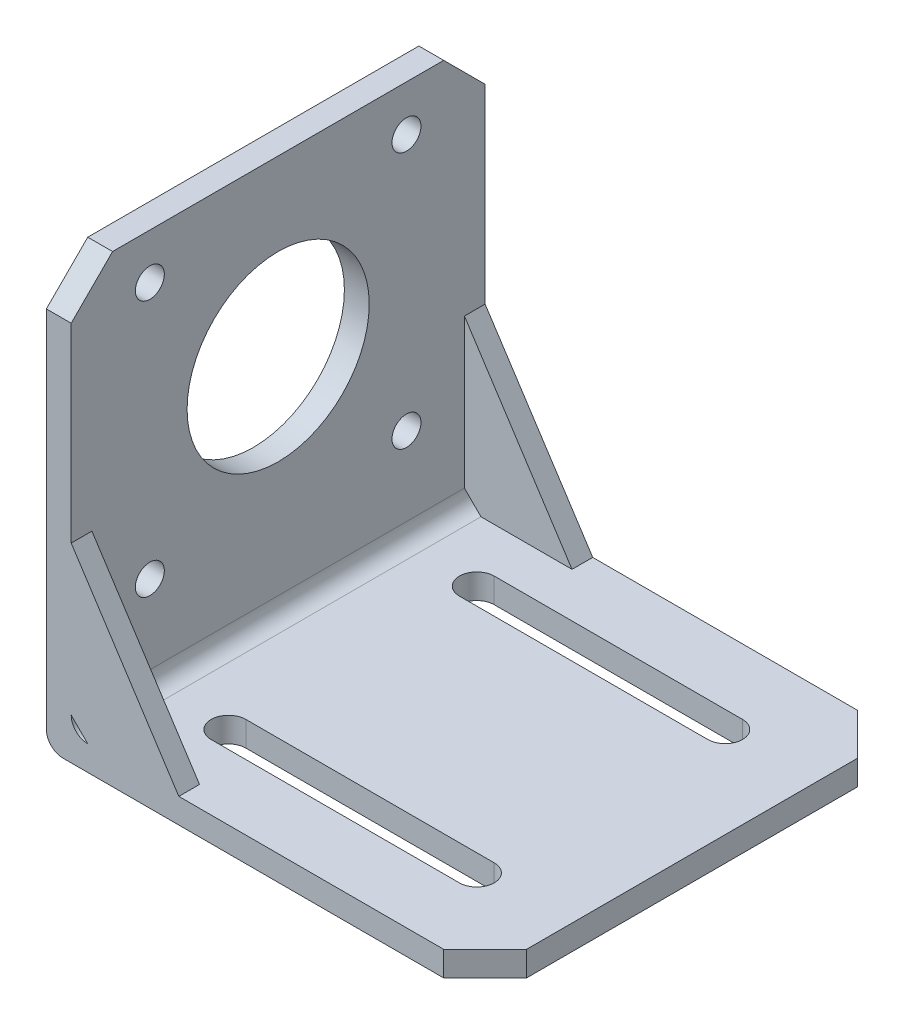
ISO-10303-21;
HEADER;
FILE_DESCRIPTION(('STEP AP214'),'2;1');
FILE_NAME('part.step','',(''),(''),'','','');
FILE_SCHEMA(('AUTOMOTIVE_DESIGN { 1 0 10303 214 1 1 1 1 }'));
ENDSEC;
DATA;
#1=APPLICATION_CONTEXT('core data for automotive mechanical design processes');
#2=APPLICATION_PROTOCOL_DEFINITION('international standard','automotive_design',2000,#1);
#3=PRODUCT_CONTEXT('',#1,'mechanical');
#4=PRODUCT('Part','Part','',(#3));
#5=PRODUCT_RELATED_PRODUCT_CATEGORY('part','',(#4));
#6=PRODUCT_DEFINITION_FORMATION('','',#4);
#7=PRODUCT_DEFINITION_CONTEXT('part definition',#1,'design');
#8=PRODUCT_DEFINITION('design','',#6,#7);
#9=PRODUCT_DEFINITION_SHAPE('','',#8);
#10=(LENGTH_UNIT() NAMED_UNIT(*) SI_UNIT(.MILLI.,.METRE.));
#11=(NAMED_UNIT(*) PLANE_ANGLE_UNIT() SI_UNIT($,.RADIAN.));
#12=(NAMED_UNIT(*) SI_UNIT($,.STERADIAN.) SOLID_ANGLE_UNIT());
#13=UNCERTAINTY_MEASURE_WITH_UNIT(LENGTH_MEASURE(1.E-05),#10,'distance_accuracy_value','');
#14=(GEOMETRIC_REPRESENTATION_CONTEXT(3) GLOBAL_UNCERTAINTY_ASSIGNED_CONTEXT((#13)) GLOBAL_UNIT_ASSIGNED_CONTEXT((#10,
#11,#12)) REPRESENTATION_CONTEXT('',''));
#15=CARTESIAN_POINT('',(0.,0.,0.));
#16=DIRECTION('',(0.,0.,1.));
#17=DIRECTION('',(1.,0.,0.));
#18=AXIS2_PLACEMENT_3D('',#15,#16,#17);
#19=CARTESIAN_POINT('',(-50.,3.,25.));
#20=DIRECTION('',(0.,-1.,0.));
#21=DIRECTION('',(0.,0.,-1.));
#22=AXIS2_PLACEMENT_3D('',#19,#20,#21);
#23=PLANE('',#22);
#24=DIRECTION('',(1.,0.,0.));
#25=VECTOR('',#24,1.);
#26=CARTESIAN_POINT('',(-41.,3.,17.1));
#27=LINE('',#26,#25);
#28=CARTESIAN_POINT('',(-41.,3.,17.1));
#29=VERTEX_POINT('',#28);
#30=CARTESIAN_POINT('',(-11.,3.,17.1));
#31=VERTEX_POINT('',#30);
#32=EDGE_CURVE('E368',#29,#31,#27,.T.);
#33=ORIENTED_EDGE('',*,*,#32,.F.);
#34=CARTESIAN_POINT('',(-41.,3.,15.));
#35=DIRECTION('',(0.,1.,0.));
#36=DIRECTION('',(0.,0.,1.));
#37=AXIS2_PLACEMENT_3D('',#34,#35,#36);
#38=CIRCLE('',#37,2.1);
#39=CARTESIAN_POINT('',(-41.,3.,12.9));
#40=VERTEX_POINT('',#39);
#41=EDGE_CURVE('E371',#40,#29,#38,.T.);
#42=ORIENTED_EDGE('',*,*,#41,.F.);
#43=DIRECTION('',(-1.,0.,0.));
#44=VECTOR('',#43,1.);
#45=CARTESIAN_POINT('',(-41.,3.,12.9));
#46=LINE('',#45,#44);
#47=CARTESIAN_POINT('',(-11.,3.,12.9));
#48=VERTEX_POINT('',#47);
#49=EDGE_CURVE('E358',#48,#40,#46,.T.);
#50=ORIENTED_EDGE('',*,*,#49,.F.);
#51=CARTESIAN_POINT('',(-11.,3.,15.));
#52=DIRECTION('',(0.,1.,0.));
#53=DIRECTION('',(0.,0.,1.));
#54=AXIS2_PLACEMENT_3D('',#51,#52,#53);
#55=CIRCLE('',#54,2.1);
#56=EDGE_CURVE('E365',#31,#48,#55,.T.);
#57=ORIENTED_EDGE('',*,*,#56,.F.);
#58=EDGE_LOOP('',(#33,#42,#50,#57));
#59=FACE_BOUND('',#58,.T.);
#60=DIRECTION('',(1.,0.,0.));
#61=VECTOR('',#60,1.);
#62=CARTESIAN_POINT('',(-41.,3.,-12.9));
#63=LINE('',#62,#61);
#64=CARTESIAN_POINT('',(-41.,3.,-12.9));
#65=VERTEX_POINT('',#64);
#66=CARTESIAN_POINT('',(-11.,3.,-12.9));
#67=VERTEX_POINT('',#66);
#68=EDGE_CURVE('E399',#65,#67,#63,.T.);
#69=ORIENTED_EDGE('',*,*,#68,.F.);
#70=CARTESIAN_POINT('',(-41.,3.,-15.));
#71=DIRECTION('',(0.,1.,0.));
#72=DIRECTION('',(0.,0.,1.));
#73=AXIS2_PLACEMENT_3D('',#70,#71,#72);
#74=CIRCLE('',#73,2.1);
#75=CARTESIAN_POINT('',(-41.,3.,-17.1));
#76=VERTEX_POINT('',#75);
#77=EDGE_CURVE('E402',#76,#65,#74,.T.);
#78=ORIENTED_EDGE('',*,*,#77,.F.);
#79=DIRECTION('',(-1.,0.,0.));
#80=VECTOR('',#79,1.);
#81=CARTESIAN_POINT('',(-41.,3.,-17.1));
#82=LINE('',#81,#80);
#83=CARTESIAN_POINT('',(-11.,3.,-17.1));
#84=VERTEX_POINT('',#83);
#85=EDGE_CURVE('E389',#84,#76,#82,.T.);
#86=ORIENTED_EDGE('',*,*,#85,.F.);
#87=CARTESIAN_POINT('',(-11.,3.,-15.));
#88=DIRECTION('',(0.,1.,0.));
#89=DIRECTION('',(0.,0.,1.));
#90=AXIS2_PLACEMENT_3D('',#87,#88,#89);
#91=CIRCLE('',#90,2.1);
#92=EDGE_CURVE('E396',#67,#84,#91,.T.);
#93=ORIENTED_EDGE('',*,*,#92,.F.);
#94=EDGE_LOOP('',(#69,#78,#86,#93));
#95=FACE_BOUND('',#94,.T.);
#96=DIRECTION('',(0.,0.,-1.));
#97=VECTOR('',#96,1.);
#98=CARTESIAN_POINT('',(-37.,3.,-22.5));
#99=LINE('',#98,#97);
#100=CARTESIAN_POINT('',(-37.,3.,-22.5));
#101=VERTEX_POINT('',#100);
#102=CARTESIAN_POINT('',(-37.,3.,-25.));
#103=VERTEX_POINT('',#102);
#104=EDGE_CURVE('E51',#101,#103,#99,.T.);
#105=ORIENTED_EDGE('',*,*,#104,.F.);
#106=DIRECTION('',(1.,0.,0.));
#107=VECTOR('',#106,1.);
#108=CARTESIAN_POINT('',(-48.,3.,-22.5));
#109=LINE('',#108,#107);
#110=CARTESIAN_POINT('',(-48.,3.,-22.5));
#111=VERTEX_POINT('',#110);
#112=EDGE_CURVE('E219',#111,#101,#109,.T.);
#113=ORIENTED_EDGE('',*,*,#112,.F.);
#114=DIRECTION('',(0.,0.,-1.));
#115=VECTOR('',#114,1.);
#116=CARTESIAN_POINT('',(-48.,3.,25.));
#117=LINE('',#116,#115);
#118=CARTESIAN_POINT('',(-48.,3.,22.5));
#119=VERTEX_POINT('',#118);
#120=EDGE_CURVE('E210',#111,#119,#117,.F.);
#121=ORIENTED_EDGE('',*,*,#120,.T.);
#122=DIRECTION('',(1.,0.,0.));
#123=VECTOR('',#122,1.);
#124=CARTESIAN_POINT('',(-48.,3.,22.5));
#125=LINE('',#124,#123);
#126=CARTESIAN_POINT('',(-37.,3.,22.5));
#127=VERTEX_POINT('',#126);
#128=EDGE_CURVE('E414',#119,#127,#125,.T.);
#129=ORIENTED_EDGE('',*,*,#128,.T.);
#130=DIRECTION('',(0.,0.,1.));
#131=VECTOR('',#130,1.);
#132=CARTESIAN_POINT('',(-37.,3.,22.5));
#133=LINE('',#132,#131);
#134=CARTESIAN_POINT('',(-37.,3.,25.));
#135=VERTEX_POINT('',#134);
#136=EDGE_CURVE('E381',#127,#135,#133,.T.);
#137=ORIENTED_EDGE('',*,*,#136,.T.);
#138=DIRECTION('',(-1.,0.,0.));
#139=VECTOR('',#138,1.);
#140=CARTESIAN_POINT('',(-50.,3.,25.));
#141=LINE('',#140,#139);
#142=CARTESIAN_POINT('',(-4.99999999999999,3.,25.));
#143=VERTEX_POINT('',#142);
#144=EDGE_CURVE('E302',#143,#135,#141,.T.);
#145=ORIENTED_EDGE('',*,*,#144,.F.);
#146=DIRECTION('',(-0.707106781186547,0.,0.707106781186549));
#147=VECTOR('',#146,1.);
#148=CARTESIAN_POINT('',(-4.99999999999999,3.,25.));
#149=LINE('',#148,#147);
#150=CARTESIAN_POINT('',(0.,3.,20.));
#151=VERTEX_POINT('',#150);
#152=EDGE_CURVE('E280',#143,#151,#149,.F.);
#153=ORIENTED_EDGE('',*,*,#152,.T.);
#154=DIRECTION('',(0.,0.,-1.));
#155=VECTOR('',#154,1.);
#156=CARTESIAN_POINT('',(0.,3.,25.));
#157=LINE('',#156,#155);
#158=CARTESIAN_POINT('',(0.,3.,-20.));
#159=VERTEX_POINT('',#158);
#160=EDGE_CURVE('E287',#151,#159,#157,.T.);
#161=ORIENTED_EDGE('',*,*,#160,.T.);
#162=DIRECTION('',(-0.707106781186549,0.,-0.707106781186547));
#163=VECTOR('',#162,1.);
#164=CARTESIAN_POINT('',(0.,3.,-20.));
#165=LINE('',#164,#163);
#166=CARTESIAN_POINT('',(-5.00000000000002,3.,-25.));
#167=VERTEX_POINT('',#166);
#168=EDGE_CURVE('E278',#159,#167,#165,.T.);
#169=ORIENTED_EDGE('',*,*,#168,.T.);
#170=DIRECTION('',(-1.,0.,0.));
#171=VECTOR('',#170,1.);
#172=CARTESIAN_POINT('',(-50.,3.,-25.));
#173=LINE('',#172,#171);
#174=EDGE_CURVE('E308',#167,#103,#173,.T.);
#175=ORIENTED_EDGE('',*,*,#174,.T.);
#176=EDGE_LOOP('',(#105,#113,#121,#129,#137,#145,#153,#161,#169,#175));
#177=FACE_BOUND('',#176,.T.);
#178=ADVANCED_FACE('F36',(#59,#95,#177),#23,.F.);
#179=CARTESIAN_POINT('',(-50.,51.,25.));
#180=DIRECTION('',(-1.,0.,0.));
#181=DIRECTION('',(0.,-1.,0.));
#182=AXIS2_PLACEMENT_3D('',#179,#180,#181);
#183=PLANE('',#182);
#184=CARTESIAN_POINT('',(-50.,30.,0.));
#185=DIRECTION('',(1.,0.,0.));
#186=DIRECTION('',(0.,1.,0.));
#187=AXIS2_PLACEMENT_3D('',#184,#185,#186);
#188=CIRCLE('',#187,11.);
#189=CARTESIAN_POINT('',(-50.,41.,0.));
#190=VERTEX_POINT('',#189);
#191=EDGE_CURVE('E321',#190,#190,#188,.T.);
#192=ORIENTED_EDGE('',*,*,#191,.F.);
#193=EDGE_LOOP('',(#192));
#194=FACE_BOUND('',#193,.T.);
#195=CARTESIAN_POINT('',(-50.,45.5000000000001,15.5));
#196=DIRECTION('',(1.,0.,0.));
#197=DIRECTION('',(0.,1.,0.));
#198=AXIS2_PLACEMENT_3D('',#195,#196,#197);
#199=CIRCLE('',#198,1.75);
#200=CARTESIAN_POINT('',(-50.,47.2500000000001,15.5));
#201=VERTEX_POINT('',#200);
#202=EDGE_CURVE('E342',#201,#201,#199,.T.);
#203=ORIENTED_EDGE('',*,*,#202,.F.);
#204=EDGE_LOOP('',(#203));
#205=FACE_BOUND('',#204,.T.);
#206=CARTESIAN_POINT('',(-50.,45.5000000000001,-15.5));
#207=DIRECTION('',(1.,0.,0.));
#208=DIRECTION('',(0.,1.,0.));
#209=AXIS2_PLACEMENT_3D('',#206,#207,#208);
#210=CIRCLE('',#209,1.75);
#211=CARTESIAN_POINT('',(-50.,47.2500000000001,-15.5));
#212=VERTEX_POINT('',#211);
#213=EDGE_CURVE('E336',#212,#212,#210,.T.);
#214=ORIENTED_EDGE('',*,*,#213,.F.);
#215=EDGE_LOOP('',(#214));
#216=FACE_BOUND('',#215,.T.);
#217=CARTESIAN_POINT('',(-50.,14.4999999999999,15.5));
#218=DIRECTION('',(1.,0.,0.));
#219=DIRECTION('',(0.,1.,0.));
#220=AXIS2_PLACEMENT_3D('',#217,#218,#219);
#221=CIRCLE('',#220,1.75);
#222=CARTESIAN_POINT('',(-50.,16.2499999999999,15.5));
#223=VERTEX_POINT('',#222);
#224=EDGE_CURVE('E328',#223,#223,#221,.T.);
#225=ORIENTED_EDGE('',*,*,#224,.F.);
#226=EDGE_LOOP('',(#225));
#227=FACE_BOUND('',#226,.T.);
#228=CARTESIAN_POINT('',(-50.,14.4999999999999,-15.5));
#229=DIRECTION('',(1.,0.,0.));
#230=DIRECTION('',(0.,1.,0.));
#231=AXIS2_PLACEMENT_3D('',#228,#229,#230);
#232=CIRCLE('',#231,1.75);
#233=CARTESIAN_POINT('',(-50.,16.2499999999999,-15.5));
#234=VERTEX_POINT('',#233);
#235=EDGE_CURVE('E329',#234,#234,#232,.T.);
#236=ORIENTED_EDGE('',*,*,#235,.F.);
#237=EDGE_LOOP('',(#236));
#238=FACE_BOUND('',#237,.T.);
#239=DIRECTION('',(0.,0.,-1.));
#240=VECTOR('',#239,1.);
#241=CARTESIAN_POINT('',(-50.,23.,-22.5));
#242=LINE('',#241,#240);
#243=CARTESIAN_POINT('',(-50.,23.,-22.5));
#244=VERTEX_POINT('',#243);
#245=CARTESIAN_POINT('',(-50.,23.,-25.));
#246=VERTEX_POINT('',#245);
#247=EDGE_CURVE('E424',#244,#246,#242,.T.);
#248=ORIENTED_EDGE('',*,*,#247,.T.);
#249=DIRECTION('',(0.,1.,0.));
#250=VECTOR('',#249,1.);
#251=CARTESIAN_POINT('',(-50.,51.,-25.));
#252=LINE('',#251,#250);
#253=CARTESIAN_POINT('',(-50.,46.,-25.));
#254=VERTEX_POINT('',#253);
#255=EDGE_CURVE('E306',#246,#254,#252,.T.);
#256=ORIENTED_EDGE('',*,*,#255,.T.);
#257=DIRECTION('',(0.,0.707106781186549,0.707106781186547));
#258=VECTOR('',#257,1.);
#259=CARTESIAN_POINT('',(-50.,51.,-20.));
#260=LINE('',#259,#258);
#261=CARTESIAN_POINT('',(-50.,51.,-20.));
#262=VERTEX_POINT('',#261);
#263=EDGE_CURVE('E247',#254,#262,#260,.T.);
#264=ORIENTED_EDGE('',*,*,#263,.T.);
#265=DIRECTION('',(0.,0.,-1.));
#266=VECTOR('',#265,1.);
#267=CARTESIAN_POINT('',(-50.,51.,25.));
#268=LINE('',#267,#266);
#269=CARTESIAN_POINT('',(-50.,51.,20.));
#270=VERTEX_POINT('',#269);
#271=EDGE_CURVE('E290',#270,#262,#268,.T.);
#272=ORIENTED_EDGE('',*,*,#271,.F.);
#273=DIRECTION('',(0.,0.707106781186547,-0.707106781186549));
#274=VECTOR('',#273,1.);
#275=CARTESIAN_POINT('',(-50.,46.,25.));
#276=LINE('',#275,#274);
#277=CARTESIAN_POINT('',(-50.,46.,25.));
#278=VERTEX_POINT('',#277);
#279=EDGE_CURVE('E249',#270,#278,#276,.F.);
#280=ORIENTED_EDGE('',*,*,#279,.T.);
#281=DIRECTION('',(0.,1.,0.));
#282=VECTOR('',#281,1.);
#283=CARTESIAN_POINT('',(-50.,51.,25.));
#284=LINE('',#283,#282);
#285=CARTESIAN_POINT('',(-50.,23.,25.));
#286=VERTEX_POINT('',#285);
#287=EDGE_CURVE('E315',#286,#278,#284,.T.);
#288=ORIENTED_EDGE('',*,*,#287,.F.);
#289=DIRECTION('',(0.,0.,1.));
#290=VECTOR('',#289,1.);
#291=CARTESIAN_POINT('',(-50.,23.,22.5));
#292=LINE('',#291,#290);
#293=CARTESIAN_POINT('',(-50.,23.,22.5));
#294=VERTEX_POINT('',#293);
#295=EDGE_CURVE('E411',#294,#286,#292,.T.);
#296=ORIENTED_EDGE('',*,*,#295,.F.);
#297=DIRECTION('',(0.,-1.,0.));
#298=VECTOR('',#297,1.);
#299=CARTESIAN_POINT('',(-50.,23.,22.5));
#300=LINE('',#299,#298);
#301=CARTESIAN_POINT('',(-50.,5.,22.5));
#302=VERTEX_POINT('',#301);
#303=EDGE_CURVE('E428',#294,#302,#300,.T.);
#304=ORIENTED_EDGE('',*,*,#303,.T.);
#305=DIRECTION('',(0.,0.,-1.));
#306=VECTOR('',#305,1.);
#307=CARTESIAN_POINT('',(-50.,5.,-25.));
#308=LINE('',#307,#306);
#309=CARTESIAN_POINT('',(-50.,5.,-22.5));
#310=VERTEX_POINT('',#309);
#311=EDGE_CURVE('E237',#302,#310,#308,.T.);
#312=ORIENTED_EDGE('',*,*,#311,.T.);
#313=DIRECTION('',(0.,-1.,0.));
#314=VECTOR('',#313,1.);
#315=CARTESIAN_POINT('',(-50.,23.,-22.5));
#316=LINE('',#315,#314);
#317=EDGE_CURVE('E59',#244,#310,#316,.T.);
#318=ORIENTED_EDGE('',*,*,#317,.F.);
#319=EDGE_LOOP('',(#248,#256,#264,#272,#280,#288,#296,#304,#312,#318));
#320=FACE_BOUND('',#319,.T.);
#321=ADVANCED_FACE('F447',(#194,#205,#216,#227,#238,#320),#183,.F.);
#322=CARTESIAN_POINT('',(0.,3.,25.));
#323=DIRECTION('',(-1.,0.,0.));
#324=DIRECTION('',(0.,-1.,0.));
#325=AXIS2_PLACEMENT_3D('',#322,#323,#324);
#326=PLANE('',#325);
#327=DIRECTION('',(0.,0.,-1.));
#328=VECTOR('',#327,1.);
#329=CARTESIAN_POINT('',(0.,0.,25.));
#330=LINE('',#329,#328);
#331=CARTESIAN_POINT('',(0.,0.,20.));
#332=VERTEX_POINT('',#331);
#333=CARTESIAN_POINT('',(0.,0.,-20.));
#334=VERTEX_POINT('',#333);
#335=EDGE_CURVE('E296',#332,#334,#330,.T.);
#336=ORIENTED_EDGE('',*,*,#335,.T.);
#337=DIRECTION('',(0.,1.,0.));
#338=VECTOR('',#337,1.);
#339=CARTESIAN_POINT('',(0.,3.,-20.));
#340=LINE('',#339,#338);
#341=EDGE_CURVE('E282',#334,#159,#340,.T.);
#342=ORIENTED_EDGE('',*,*,#341,.T.);
#343=ORIENTED_EDGE('',*,*,#160,.F.);
#344=DIRECTION('',(0.,-1.,0.));
#345=VECTOR('',#344,1.);
#346=CARTESIAN_POINT('',(0.,3.,20.));
#347=LINE('',#346,#345);
#348=EDGE_CURVE('E285',#151,#332,#347,.T.);
#349=ORIENTED_EDGE('',*,*,#348,.T.);
#350=EDGE_LOOP('',(#336,#342,#343,#349));
#351=FACE_BOUND('',#350,.T.);
#352=ADVANCED_FACE('F506',(#351),#326,.F.);
#353=CARTESIAN_POINT('',(-53.,51.,25.));
#354=DIRECTION('',(0.,-1.,0.));
#355=DIRECTION('',(0.,0.,-1.));
#356=AXIS2_PLACEMENT_3D('',#353,#354,#355);
#357=PLANE('',#356);
#358=ORIENTED_EDGE('',*,*,#271,.T.);
#359=DIRECTION('',(-1.,0.,0.));
#360=VECTOR('',#359,1.);
#361=CARTESIAN_POINT('',(-53.,51.,-20.));
#362=LINE('',#361,#360);
#363=CARTESIAN_POINT('',(-53.,51.,-20.));
#364=VERTEX_POINT('',#363);
#365=EDGE_CURVE('E256',#262,#364,#362,.T.);
#366=ORIENTED_EDGE('',*,*,#365,.T.);
#367=DIRECTION('',(0.,0.,-1.));
#368=VECTOR('',#367,1.);
#369=CARTESIAN_POINT('',(-53.,51.,25.));
#370=LINE('',#369,#368);
#371=CARTESIAN_POINT('',(-53.,51.,20.));
#372=VERTEX_POINT('',#371);
#373=EDGE_CURVE('E293',#372,#364,#370,.T.);
#374=ORIENTED_EDGE('',*,*,#373,.F.);
#375=DIRECTION('',(1.,0.,0.));
#376=VECTOR('',#375,1.);
#377=CARTESIAN_POINT('',(-53.,51.,20.));
#378=LINE('',#377,#376);
#379=EDGE_CURVE('E259',#372,#270,#378,.T.);
#380=ORIENTED_EDGE('',*,*,#379,.T.);
#381=EDGE_LOOP('',(#358,#366,#374,#380));
#382=FACE_BOUND('',#381,.T.);
#383=ADVANCED_FACE('F461',(#382),#357,.F.);
#384=CARTESIAN_POINT('',(-53.,0.,25.));
#385=DIRECTION('',(1.,0.,0.));
#386=DIRECTION('',(0.,0.,-1.));
#387=AXIS2_PLACEMENT_3D('',#384,#385,#386);
#388=PLANE('',#387);
#389=CARTESIAN_POINT('',(-53.,14.4999999999999,-15.5));
#390=DIRECTION('',(1.,0.,0.));
#391=DIRECTION('',(0.,0.,-1.));
#392=AXIS2_PLACEMENT_3D('',#389,#390,#391);
#393=CIRCLE('',#392,1.75);
#394=CARTESIAN_POINT('',(-53.,14.4999999999999,-17.25));
#395=VERTEX_POINT('',#394);
#396=EDGE_CURVE('E325',#395,#395,#393,.F.);
#397=ORIENTED_EDGE('',*,*,#396,.F.);
#398=EDGE_LOOP('',(#397));
#399=FACE_BOUND('',#398,.T.);
#400=CARTESIAN_POINT('',(-53.,14.4999999999999,15.5));
#401=DIRECTION('',(1.,0.,0.));
#402=DIRECTION('',(0.,0.,-1.));
#403=AXIS2_PLACEMENT_3D('',#400,#401,#402);
#404=CIRCLE('',#403,1.75);
#405=CARTESIAN_POINT('',(-53.,14.4999999999999,13.75));
#406=VERTEX_POINT('',#405);
#407=EDGE_CURVE('E333',#406,#406,#404,.F.);
#408=ORIENTED_EDGE('',*,*,#407,.F.);
#409=EDGE_LOOP('',(#408));
#410=FACE_BOUND('',#409,.T.);
#411=CARTESIAN_POINT('',(-53.,45.5000000000001,-15.5));
#412=DIRECTION('',(1.,0.,0.));
#413=DIRECTION('',(0.,0.,-1.));
#414=AXIS2_PLACEMENT_3D('',#411,#412,#413);
#415=CIRCLE('',#414,1.75);
#416=CARTESIAN_POINT('',(-53.,45.5000000000001,-17.25));
#417=VERTEX_POINT('',#416);
#418=EDGE_CURVE('E339',#417,#417,#415,.F.);
#419=ORIENTED_EDGE('',*,*,#418,.F.);
#420=EDGE_LOOP('',(#419));
#421=FACE_BOUND('',#420,.T.);
#422=CARTESIAN_POINT('',(-53.,45.5000000000001,15.5));
#423=DIRECTION('',(1.,0.,0.));
#424=DIRECTION('',(0.,0.,-1.));
#425=AXIS2_PLACEMENT_3D('',#422,#423,#424);
#426=CIRCLE('',#425,1.75);
#427=CARTESIAN_POINT('',(-53.,45.5000000000001,13.75));
#428=VERTEX_POINT('',#427);
#429=EDGE_CURVE('E324',#428,#428,#426,.F.);
#430=ORIENTED_EDGE('',*,*,#429,.F.);
#431=EDGE_LOOP('',(#430));
#432=FACE_BOUND('',#431,.T.);
#433=CARTESIAN_POINT('',(-53.,30.,0.));
#434=DIRECTION('',(1.,0.,0.));
#435=DIRECTION('',(0.,0.,-1.));
#436=AXIS2_PLACEMENT_3D('',#433,#434,#435);
#437=CIRCLE('',#436,11.);
#438=CARTESIAN_POINT('',(-53.,30.,-11.));
#439=VERTEX_POINT('',#438);
#440=EDGE_CURVE('E310',#439,#439,#437,.F.);
#441=ORIENTED_EDGE('',*,*,#440,.F.);
#442=EDGE_LOOP('',(#441));
#443=FACE_BOUND('',#442,.T.);
#444=DIRECTION('',(0.,-1.,0.));
#445=VECTOR('',#444,1.);
#446=CARTESIAN_POINT('',(-53.,0.,-25.));
#447=LINE('',#446,#445);
#448=CARTESIAN_POINT('',(-53.,46.,-25.));
#449=VERTEX_POINT('',#448);
#450=CARTESIAN_POINT('',(-53.,2.,-25.));
#451=VERTEX_POINT('',#450);
#452=EDGE_CURVE('E303',#449,#451,#447,.T.);
#453=ORIENTED_EDGE('',*,*,#452,.T.);
#454=DIRECTION('',(0.,0.,-1.));
#455=VECTOR('',#454,1.);
#456=CARTESIAN_POINT('',(-53.,2.,25.));
#457=LINE('',#456,#455);
#458=CARTESIAN_POINT('',(-53.,2.,25.));
#459=VERTEX_POINT('',#458);
#460=EDGE_CURVE('E240',#451,#459,#457,.F.);
#461=ORIENTED_EDGE('',*,*,#460,.T.);
#462=DIRECTION('',(0.,-1.,0.));
#463=VECTOR('',#462,1.);
#464=CARTESIAN_POINT('',(-53.,0.,25.));
#465=LINE('',#464,#463);
#466=CARTESIAN_POINT('',(-53.,46.,25.));
#467=VERTEX_POINT('',#466);
#468=EDGE_CURVE('E312',#467,#459,#465,.T.);
#469=ORIENTED_EDGE('',*,*,#468,.F.);
#470=DIRECTION('',(0.,-0.707106781186547,0.707106781186549));
#471=VECTOR('',#470,1.);
#472=CARTESIAN_POINT('',(-53.,46.,25.));
#473=LINE('',#472,#471);
#474=EDGE_CURVE('E254',#467,#372,#473,.F.);
#475=ORIENTED_EDGE('',*,*,#474,.T.);
#476=ORIENTED_EDGE('',*,*,#373,.T.);
#477=DIRECTION('',(0.,-0.707106781186549,-0.707106781186547));
#478=VECTOR('',#477,1.);
#479=CARTESIAN_POINT('',(-53.,51.,-20.));
#480=LINE('',#479,#478);
#481=EDGE_CURVE('E252',#364,#449,#480,.T.);
#482=ORIENTED_EDGE('',*,*,#481,.T.);
#483=EDGE_LOOP('',(#453,#461,#469,#475,#476,#482));
#484=FACE_BOUND('',#483,.T.);
#485=ADVANCED_FACE('F560',(#399,#410,#421,#432,#443,#484),#388,.F.);
#486=CARTESIAN_POINT('',(0.,0.,25.));
#487=DIRECTION('',(0.,1.,0.));
#488=DIRECTION('',(0.,0.,1.));
#489=AXIS2_PLACEMENT_3D('',#486,#487,#488);
#490=PLANE('',#489);
#491=DIRECTION('',(1.,0.,0.));
#492=VECTOR('',#491,1.);
#493=CARTESIAN_POINT('',(-41.,0.,-17.1));
#494=LINE('',#493,#492);
#495=CARTESIAN_POINT('',(-41.,0.,-17.1));
#496=VERTEX_POINT('',#495);
#497=CARTESIAN_POINT('',(-11.,0.,-17.1));
#498=VERTEX_POINT('',#497);
#499=EDGE_CURVE('E407',#496,#498,#494,.T.);
#500=ORIENTED_EDGE('',*,*,#499,.F.);
#501=CARTESIAN_POINT('',(-41.,0.,-15.));
#502=DIRECTION('',(0.,1.,0.));
#503=DIRECTION('',(0.,0.,1.));
#504=AXIS2_PLACEMENT_3D('',#501,#502,#503);
#505=CIRCLE('',#504,2.1);
#506=CARTESIAN_POINT('',(-41.,0.,-12.9));
#507=VERTEX_POINT('',#506);
#508=EDGE_CURVE('E404',#507,#496,#505,.F.);
#509=ORIENTED_EDGE('',*,*,#508,.F.);
#510=DIRECTION('',(-1.,0.,0.));
#511=VECTOR('',#510,1.);
#512=CARTESIAN_POINT('',(-41.,0.,-12.9));
#513=LINE('',#512,#511);
#514=CARTESIAN_POINT('',(-11.,0.,-12.9));
#515=VERTEX_POINT('',#514);
#516=EDGE_CURVE('E332',#515,#507,#513,.T.);
#517=ORIENTED_EDGE('',*,*,#516,.F.);
#518=CARTESIAN_POINT('',(-11.,0.,-15.));
#519=DIRECTION('',(0.,1.,0.));
#520=DIRECTION('',(0.,0.,1.));
#521=AXIS2_PLACEMENT_3D('',#518,#519,#520);
#522=CIRCLE('',#521,2.1);
#523=EDGE_CURVE('E352',#498,#515,#522,.F.);
#524=ORIENTED_EDGE('',*,*,#523,.F.);
#525=EDGE_LOOP('',(#500,#509,#517,#524));
#526=FACE_BOUND('',#525,.T.);
#527=DIRECTION('',(1.,0.,0.));
#528=VECTOR('',#527,1.);
#529=CARTESIAN_POINT('',(-41.,0.,12.9));
#530=LINE('',#529,#528);
#531=CARTESIAN_POINT('',(-41.,0.,12.9));
#532=VERTEX_POINT('',#531);
#533=CARTESIAN_POINT('',(-11.,0.,12.9));
#534=VERTEX_POINT('',#533);
#535=EDGE_CURVE('E376',#532,#534,#530,.T.);
#536=ORIENTED_EDGE('',*,*,#535,.F.);
#537=CARTESIAN_POINT('',(-41.,0.,15.));
#538=DIRECTION('',(0.,1.,0.));
#539=DIRECTION('',(0.,0.,1.));
#540=AXIS2_PLACEMENT_3D('',#537,#538,#539);
#541=CIRCLE('',#540,2.1);
#542=CARTESIAN_POINT('',(-41.,0.,17.1));
#543=VERTEX_POINT('',#542);
#544=EDGE_CURVE('E373',#543,#532,#541,.F.);
#545=ORIENTED_EDGE('',*,*,#544,.F.);
#546=DIRECTION('',(-1.,0.,0.));
#547=VECTOR('',#546,1.);
#548=CARTESIAN_POINT('',(-41.,0.,17.1));
#549=LINE('',#548,#547);
#550=CARTESIAN_POINT('',(-11.,0.,17.1));
#551=VERTEX_POINT('',#550);
#552=EDGE_CURVE('E349',#551,#543,#549,.T.);
#553=ORIENTED_EDGE('',*,*,#552,.F.);
#554=CARTESIAN_POINT('',(-11.,0.,15.));
#555=DIRECTION('',(0.,1.,0.));
#556=DIRECTION('',(0.,0.,1.));
#557=AXIS2_PLACEMENT_3D('',#554,#555,#556);
#558=CIRCLE('',#557,2.1);
#559=EDGE_CURVE('E379',#534,#551,#558,.F.);
#560=ORIENTED_EDGE('',*,*,#559,.F.);
#561=EDGE_LOOP('',(#536,#545,#553,#560));
#562=FACE_BOUND('',#561,.T.);
#563=DIRECTION('',(1.,0.,0.));
#564=VECTOR('',#563,1.);
#565=CARTESIAN_POINT('',(0.,0.,25.));
#566=LINE('',#565,#564);
#567=CARTESIAN_POINT('',(-51.,0.,25.));
#568=VERTEX_POINT('',#567);
#569=CARTESIAN_POINT('',(-4.99999999999999,0.,25.));
#570=VERTEX_POINT('',#569);
#571=EDGE_CURVE('E299',#568,#570,#566,.T.);
#572=ORIENTED_EDGE('',*,*,#571,.F.);
#573=DIRECTION('',(0.,0.,-1.));
#574=VECTOR('',#573,1.);
#575=CARTESIAN_POINT('',(-51.,0.,25.));
#576=LINE('',#575,#574);
#577=CARTESIAN_POINT('',(-51.,0.,-25.));
#578=VERTEX_POINT('',#577);
#579=EDGE_CURVE('E244',#568,#578,#576,.T.);
#580=ORIENTED_EDGE('',*,*,#579,.T.);
#581=DIRECTION('',(1.,0.,0.));
#582=VECTOR('',#581,1.);
#583=CARTESIAN_POINT('',(0.,0.,-25.));
#584=LINE('',#583,#582);
#585=CARTESIAN_POINT('',(-5.00000000000002,0.,-25.));
#586=VERTEX_POINT('',#585);
#587=EDGE_CURVE('E300',#578,#586,#584,.T.);
#588=ORIENTED_EDGE('',*,*,#587,.T.);
#589=DIRECTION('',(0.707106781186549,0.,0.707106781186547));
#590=VECTOR('',#589,1.);
#591=CARTESIAN_POINT('',(0.,0.,-20.));
#592=LINE('',#591,#590);
#593=EDGE_CURVE('E267',#586,#334,#592,.T.);
#594=ORIENTED_EDGE('',*,*,#593,.T.);
#595=ORIENTED_EDGE('',*,*,#335,.F.);
#596=DIRECTION('',(0.707106781186547,0.,-0.707106781186549));
#597=VECTOR('',#596,1.);
#598=CARTESIAN_POINT('',(-4.99999999999999,0.,25.));
#599=LINE('',#598,#597);
#600=EDGE_CURVE('E269',#332,#570,#599,.F.);
#601=ORIENTED_EDGE('',*,*,#600,.T.);
#602=EDGE_LOOP('',(#572,#580,#588,#594,#595,#601));
#603=FACE_BOUND('',#602,.T.);
#604=ADVANCED_FACE('F497',(#526,#562,#603),#490,.F.);
#605=CARTESIAN_POINT('',(0.,0.,25.));
#606=DIRECTION('',(0.,0.,-1.));
#607=DIRECTION('',(-1.,0.,0.));
#608=AXIS2_PLACEMENT_3D('',#605,#606,#607);
#609=PLANE('',#608);
#610=ORIENTED_EDGE('',*,*,#144,.T.);
#611=DIRECTION('',(-0.544988350595414,0.838443616300637,0.));
#612=VECTOR('',#611,1.);
#613=CARTESIAN_POINT('',(-37.,3.,25.));
#614=LINE('',#613,#612);
#615=EDGE_CURVE('E421',#135,#286,#614,.T.);
#616=ORIENTED_EDGE('',*,*,#615,.T.);
#617=ORIENTED_EDGE('',*,*,#287,.T.);
#618=DIRECTION('',(-1.,0.,0.));
#619=VECTOR('',#618,1.);
#620=CARTESIAN_POINT('',(0.,46.,25.));
#621=LINE('',#620,#619);
#622=EDGE_CURVE('E264',#278,#467,#621,.T.);
#623=ORIENTED_EDGE('',*,*,#622,.T.);
#624=ORIENTED_EDGE('',*,*,#468,.T.);
#625=CARTESIAN_POINT('',(-51.,2.,25.));
#626=DIRECTION('',(0.,0.,-1.));
#627=DIRECTION('',(-1.,0.,0.));
#628=AXIS2_PLACEMENT_3D('',#625,#626,#627);
#629=CIRCLE('',#628,2.);
#630=EDGE_CURVE('E238',#459,#568,#629,.F.);
#631=ORIENTED_EDGE('',*,*,#630,.T.);
#632=ORIENTED_EDGE('',*,*,#571,.T.);
#633=DIRECTION('',(0.,1.,0.));
#634=VECTOR('',#633,1.);
#635=CARTESIAN_POINT('',(-4.99999999999999,0.,25.));
#636=LINE('',#635,#634);
#637=EDGE_CURVE('E261',#570,#143,#636,.T.);
#638=ORIENTED_EDGE('',*,*,#637,.T.);
#639=EDGE_LOOP('',(#610,#616,#617,#623,#624,#631,#632,#638));
#640=FACE_BOUND('',#639,.T.);
#641=DIRECTION('',(0.707106781186548,-0.707106781186547,0.));
#642=VECTOR('',#641,1.);
#643=CARTESIAN_POINT('',(-50.,5.,25.));
#644=LINE('',#643,#642);
#645=CARTESIAN_POINT('',(-50.,5.,25.));
#646=VERTEX_POINT('',#645);
#647=CARTESIAN_POINT('',(-48.,3.,25.));
#648=VERTEX_POINT('',#647);
#649=EDGE_CURVE('E417',#646,#648,#644,.T.);
#650=ORIENTED_EDGE('',*,*,#649,.T.);
#651=CARTESIAN_POINT('',(-48.,5.,25.));
#652=DIRECTION('',(0.,0.,-1.));
#653=DIRECTION('',(-1.,0.,0.));
#654=AXIS2_PLACEMENT_3D('',#651,#652,#653);
#655=CIRCLE('',#654,2.);
#656=EDGE_CURVE('E11',#648,#646,#655,.T.);
#657=ORIENTED_EDGE('',*,*,#656,.T.);
#658=EDGE_LOOP('',(#650,#657));
#659=FACE_BOUND('',#658,.T.);
#660=ADVANCED_FACE('F474',(#640,#659),#609,.F.);
#661=CARTESIAN_POINT('',(0.,0.,-25.));
#662=DIRECTION('',(0.,0.,-1.));
#663=DIRECTION('',(-1.,0.,0.));
#664=AXIS2_PLACEMENT_3D('',#661,#662,#663);
#665=PLANE('',#664);
#666=ORIENTED_EDGE('',*,*,#255,.F.);
#667=DIRECTION('',(-0.544988350595414,0.838443616300637,0.));
#668=VECTOR('',#667,1.);
#669=CARTESIAN_POINT('',(-37.,3.,-25.));
#670=LINE('',#669,#668);
#671=EDGE_CURVE('E438',#103,#246,#670,.T.);
#672=ORIENTED_EDGE('',*,*,#671,.F.);
#673=ORIENTED_EDGE('',*,*,#174,.F.);
#674=DIRECTION('',(0.,-1.,0.));
#675=VECTOR('',#674,1.);
#676=CARTESIAN_POINT('',(-5.00000000000002,0.,-25.));
#677=LINE('',#676,#675);
#678=EDGE_CURVE('E272',#167,#586,#677,.T.);
#679=ORIENTED_EDGE('',*,*,#678,.T.);
#680=ORIENTED_EDGE('',*,*,#587,.F.);
#681=CARTESIAN_POINT('',(-51.,2.,-25.));
#682=DIRECTION('',(0.,0.,-1.));
#683=DIRECTION('',(-1.,0.,0.));
#684=AXIS2_PLACEMENT_3D('',#681,#682,#683);
#685=CIRCLE('',#684,2.);
#686=EDGE_CURVE('E242',#578,#451,#685,.T.);
#687=ORIENTED_EDGE('',*,*,#686,.T.);
#688=ORIENTED_EDGE('',*,*,#452,.F.);
#689=DIRECTION('',(1.,0.,0.));
#690=VECTOR('',#689,1.);
#691=CARTESIAN_POINT('',(-50.,46.,-25.));
#692=LINE('',#691,#690);
#693=EDGE_CURVE('E275',#449,#254,#692,.T.);
#694=ORIENTED_EDGE('',*,*,#693,.T.);
#695=EDGE_LOOP('',(#666,#672,#673,#679,#680,#687,#688,#694));
#696=FACE_BOUND('',#695,.T.);
#697=DIRECTION('',(0.707106781186548,-0.707106781186547,0.));
#698=VECTOR('',#697,1.);
#699=CARTESIAN_POINT('',(-50.,5.,-25.));
#700=LINE('',#699,#698);
#701=CARTESIAN_POINT('',(-50.,5.,-25.));
#702=VERTEX_POINT('',#701);
#703=CARTESIAN_POINT('',(-48.,3.,-25.));
#704=VERTEX_POINT('',#703);
#705=EDGE_CURVE('E233',#702,#704,#700,.T.);
#706=ORIENTED_EDGE('',*,*,#705,.F.);
#707=CARTESIAN_POINT('',(-48.,5.,-25.));
#708=DIRECTION('',(0.,0.,-1.));
#709=DIRECTION('',(-1.,0.,0.));
#710=AXIS2_PLACEMENT_3D('',#707,#708,#709);
#711=CIRCLE('',#710,2.);
#712=EDGE_CURVE('E44',#702,#704,#711,.F.);
#713=ORIENTED_EDGE('',*,*,#712,.T.);
#714=EDGE_LOOP('',(#706,#713));
#715=FACE_BOUND('',#714,.T.);
#716=ADVANCED_FACE('F449',(#696,#715),#665,.T.);
#717=CARTESIAN_POINT('',(-53.001,30.,0.));
#718=DIRECTION('',(1.,0.,0.));
#719=DIRECTION('',(0.,1.,0.));
#720=AXIS2_PLACEMENT_3D('',#717,#718,#719);
#721=CYLINDRICAL_SURFACE('',#720,11.);
#722=ORIENTED_EDGE('',*,*,#191,.T.);
#723=EDGE_LOOP('',(#722));
#724=FACE_BOUND('',#723,.T.);
#725=ORIENTED_EDGE('',*,*,#440,.T.);
#726=EDGE_LOOP('',(#725));
#727=FACE_BOUND('',#726,.T.);
#728=ADVANCED_FACE('F488',(#724,#727),#721,.F.);
#729=CARTESIAN_POINT('',(-53.001,45.5000000000001,15.5));
#730=DIRECTION('',(1.,0.,0.));
#731=DIRECTION('',(0.,1.,0.));
#732=AXIS2_PLACEMENT_3D('',#729,#730,#731);
#733=CYLINDRICAL_SURFACE('',#732,1.75);
#734=ORIENTED_EDGE('',*,*,#202,.T.);
#735=EDGE_LOOP('',(#734));
#736=FACE_BOUND('',#735,.T.);
#737=ORIENTED_EDGE('',*,*,#429,.T.);
#738=EDGE_LOOP('',(#737));
#739=FACE_BOUND('',#738,.T.);
#740=ADVANCED_FACE('F494',(#736,#739),#733,.F.);
#741=CARTESIAN_POINT('',(-53.001,45.5000000000001,-15.5));
#742=DIRECTION('',(1.,0.,0.));
#743=DIRECTION('',(0.,1.,0.));
#744=AXIS2_PLACEMENT_3D('',#741,#742,#743);
#745=CYLINDRICAL_SURFACE('',#744,1.75);
#746=ORIENTED_EDGE('',*,*,#213,.T.);
#747=EDGE_LOOP('',(#746));
#748=FACE_BOUND('',#747,.T.);
#749=ORIENTED_EDGE('',*,*,#418,.T.);
#750=EDGE_LOOP('',(#749));
#751=FACE_BOUND('',#750,.T.);
#752=ADVANCED_FACE('F581',(#748,#751),#745,.F.);
#753=CARTESIAN_POINT('',(-53.001,14.4999999999999,15.5));
#754=DIRECTION('',(1.,0.,0.));
#755=DIRECTION('',(0.,1.,0.));
#756=AXIS2_PLACEMENT_3D('',#753,#754,#755);
#757=CYLINDRICAL_SURFACE('',#756,1.75);
#758=ORIENTED_EDGE('',*,*,#224,.T.);
#759=EDGE_LOOP('',(#758));
#760=FACE_BOUND('',#759,.T.);
#761=ORIENTED_EDGE('',*,*,#407,.T.);
#762=EDGE_LOOP('',(#761));
#763=FACE_BOUND('',#762,.T.);
#764=ADVANCED_FACE('F587',(#760,#763),#757,.F.);
#765=CARTESIAN_POINT('',(-53.001,14.4999999999999,-15.5));
#766=DIRECTION('',(1.,0.,0.));
#767=DIRECTION('',(0.,1.,0.));
#768=AXIS2_PLACEMENT_3D('',#765,#766,#767);
#769=CYLINDRICAL_SURFACE('',#768,1.75);
#770=ORIENTED_EDGE('',*,*,#235,.T.);
#771=EDGE_LOOP('',(#770));
#772=FACE_BOUND('',#771,.T.);
#773=ORIENTED_EDGE('',*,*,#396,.T.);
#774=EDGE_LOOP('',(#773));
#775=FACE_BOUND('',#774,.T.);
#776=ADVANCED_FACE('F596',(#772,#775),#769,.F.);
#777=CARTESIAN_POINT('',(-41.,-0.00100000000000013,15.));
#778=DIRECTION('',(0.,1.,0.));
#779=DIRECTION('',(0.,0.,1.));
#780=AXIS2_PLACEMENT_3D('',#777,#778,#779);
#781=CYLINDRICAL_SURFACE('',#780,2.1);
#782=ORIENTED_EDGE('',*,*,#544,.T.);
#783=DIRECTION('',(0.,1.,0.));
#784=VECTOR('',#783,1.);
#785=CARTESIAN_POINT('',(-41.,-0.00100000000000013,12.9));
#786=LINE('',#785,#784);
#787=EDGE_CURVE('E353',#532,#40,#786,.T.);
#788=ORIENTED_EDGE('',*,*,#787,.T.);
#789=ORIENTED_EDGE('',*,*,#41,.T.);
#790=DIRECTION('',(0.,1.,0.));
#791=VECTOR('',#790,1.);
#792=CARTESIAN_POINT('',(-41.,-0.00100000000000013,17.1));
#793=LINE('',#792,#791);
#794=EDGE_CURVE('E354',#543,#29,#793,.T.);
#795=ORIENTED_EDGE('',*,*,#794,.F.);
#796=EDGE_LOOP('',(#782,#788,#789,#795));
#797=FACE_BOUND('',#796,.T.);
#798=ADVANCED_FACE('F591',(#797),#781,.F.);
#799=CARTESIAN_POINT('',(-41.,-0.00100000000000013,12.9));
#800=DIRECTION('',(0.,0.,-1.));
#801=DIRECTION('',(-1.,0.,0.));
#802=AXIS2_PLACEMENT_3D('',#799,#800,#801);
#803=PLANE('',#802);
#804=ORIENTED_EDGE('',*,*,#535,.T.);
#805=DIRECTION('',(0.,1.,0.));
#806=VECTOR('',#805,1.);
#807=CARTESIAN_POINT('',(-11.,-0.00100000000000013,12.9));
#808=LINE('',#807,#806);
#809=EDGE_CURVE('E360',#534,#48,#808,.T.);
#810=ORIENTED_EDGE('',*,*,#809,.T.);
#811=ORIENTED_EDGE('',*,*,#49,.T.);
#812=ORIENTED_EDGE('',*,*,#787,.F.);
#813=EDGE_LOOP('',(#804,#810,#811,#812));
#814=FACE_BOUND('',#813,.T.);
#815=ADVANCED_FACE('F603',(#814),#803,.F.);
#816=CARTESIAN_POINT('',(-11.,-0.00100000000000013,15.));
#817=DIRECTION('',(0.,1.,0.));
#818=DIRECTION('',(0.,0.,1.));
#819=AXIS2_PLACEMENT_3D('',#816,#817,#818);
#820=CYLINDRICAL_SURFACE('',#819,2.1);
#821=ORIENTED_EDGE('',*,*,#559,.T.);
#822=DIRECTION('',(0.,1.,0.));
#823=VECTOR('',#822,1.);
#824=CARTESIAN_POINT('',(-11.,-0.00100000000000013,17.1));
#825=LINE('',#824,#823);
#826=EDGE_CURVE('E357',#551,#31,#825,.T.);
#827=ORIENTED_EDGE('',*,*,#826,.T.);
#828=ORIENTED_EDGE('',*,*,#56,.T.);
#829=ORIENTED_EDGE('',*,*,#809,.F.);
#830=EDGE_LOOP('',(#821,#827,#828,#829));
#831=FACE_BOUND('',#830,.T.);
#832=ADVANCED_FACE('F611',(#831),#820,.F.);
#833=CARTESIAN_POINT('',(-41.,-0.00100000000000013,17.1));
#834=DIRECTION('',(0.,0.,1.));
#835=DIRECTION('',(1.,0.,0.));
#836=AXIS2_PLACEMENT_3D('',#833,#834,#835);
#837=PLANE('',#836);
#838=ORIENTED_EDGE('',*,*,#552,.T.);
#839=ORIENTED_EDGE('',*,*,#794,.T.);
#840=ORIENTED_EDGE('',*,*,#32,.T.);
#841=ORIENTED_EDGE('',*,*,#826,.F.);
#842=EDGE_LOOP('',(#838,#839,#840,#841));
#843=FACE_BOUND('',#842,.T.);
#844=ADVANCED_FACE('F623',(#843),#837,.F.);
#845=CARTESIAN_POINT('',(-41.,-0.00100000000000013,-15.));
#846=DIRECTION('',(0.,1.,0.));
#847=DIRECTION('',(0.,0.,1.));
#848=AXIS2_PLACEMENT_3D('',#845,#846,#847);
#849=CYLINDRICAL_SURFACE('',#848,2.1);
#850=ORIENTED_EDGE('',*,*,#508,.T.);
#851=DIRECTION('',(0.,1.,0.));
#852=VECTOR('',#851,1.);
#853=CARTESIAN_POINT('',(-41.,-0.00100000000000013,-17.1));
#854=LINE('',#853,#852);
#855=EDGE_CURVE('E384',#496,#76,#854,.T.);
#856=ORIENTED_EDGE('',*,*,#855,.T.);
#857=ORIENTED_EDGE('',*,*,#77,.T.);
#858=DIRECTION('',(0.,1.,0.));
#859=VECTOR('',#858,1.);
#860=CARTESIAN_POINT('',(-41.,-0.00100000000000013,-12.9));
#861=LINE('',#860,#859);
#862=EDGE_CURVE('E385',#507,#65,#861,.T.);
#863=ORIENTED_EDGE('',*,*,#862,.F.);
#864=EDGE_LOOP('',(#850,#856,#857,#863));
#865=FACE_BOUND('',#864,.T.);
#866=ADVANCED_FACE('F631',(#865),#849,.F.);
#867=CARTESIAN_POINT('',(-41.,-0.00100000000000013,-17.1));
#868=DIRECTION('',(0.,0.,-1.));
#869=DIRECTION('',(-1.,0.,0.));
#870=AXIS2_PLACEMENT_3D('',#867,#868,#869);
#871=PLANE('',#870);
#872=ORIENTED_EDGE('',*,*,#499,.T.);
#873=DIRECTION('',(0.,1.,0.));
#874=VECTOR('',#873,1.);
#875=CARTESIAN_POINT('',(-11.,-0.00100000000000013,-17.1));
#876=LINE('',#875,#874);
#877=EDGE_CURVE('E391',#498,#84,#876,.T.);
#878=ORIENTED_EDGE('',*,*,#877,.T.);
#879=ORIENTED_EDGE('',*,*,#85,.T.);
#880=ORIENTED_EDGE('',*,*,#855,.F.);
#881=EDGE_LOOP('',(#872,#878,#879,#880));
#882=FACE_BOUND('',#881,.T.);
#883=ADVANCED_FACE('F635',(#882),#871,.F.);
#884=CARTESIAN_POINT('',(-11.,-0.00100000000000013,-15.));
#885=DIRECTION('',(0.,1.,0.));
#886=DIRECTION('',(0.,0.,1.));
#887=AXIS2_PLACEMENT_3D('',#884,#885,#886);
#888=CYLINDRICAL_SURFACE('',#887,2.1);
#889=ORIENTED_EDGE('',*,*,#523,.T.);
#890=DIRECTION('',(0.,1.,0.));
#891=VECTOR('',#890,1.);
#892=CARTESIAN_POINT('',(-11.,-0.00100000000000013,-12.9));
#893=LINE('',#892,#891);
#894=EDGE_CURVE('E388',#515,#67,#893,.T.);
#895=ORIENTED_EDGE('',*,*,#894,.T.);
#896=ORIENTED_EDGE('',*,*,#92,.T.);
#897=ORIENTED_EDGE('',*,*,#877,.F.);
#898=EDGE_LOOP('',(#889,#895,#896,#897));
#899=FACE_BOUND('',#898,.T.);
#900=ADVANCED_FACE('F639',(#899),#888,.F.);
#901=CARTESIAN_POINT('',(-41.,-0.00100000000000013,-12.9));
#902=DIRECTION('',(0.,0.,1.));
#903=DIRECTION('',(1.,0.,0.));
#904=AXIS2_PLACEMENT_3D('',#901,#902,#903);
#905=PLANE('',#904);
#906=ORIENTED_EDGE('',*,*,#516,.T.);
#907=ORIENTED_EDGE('',*,*,#862,.T.);
#908=ORIENTED_EDGE('',*,*,#68,.T.);
#909=ORIENTED_EDGE('',*,*,#894,.F.);
#910=EDGE_LOOP('',(#906,#907,#908,#909));
#911=FACE_BOUND('',#910,.T.);
#912=ADVANCED_FACE('F524',(#911),#905,.F.);
#913=CARTESIAN_POINT('',(0.,3.,-20.));
#914=DIRECTION('',(0.707106781186547,0.,-0.707106781186549));
#915=DIRECTION('',(0.,-1.,0.));
#916=AXIS2_PLACEMENT_3D('',#913,#914,#915);
#917=PLANE('',#916);
#918=ORIENTED_EDGE('',*,*,#593,.F.);
#919=ORIENTED_EDGE('',*,*,#678,.F.);
#920=ORIENTED_EDGE('',*,*,#168,.F.);
#921=ORIENTED_EDGE('',*,*,#341,.F.);
#922=EDGE_LOOP('',(#918,#919,#920,#921));
#923=FACE_BOUND('',#922,.T.);
#924=ADVANCED_FACE('F517',(#923),#917,.T.);
#925=CARTESIAN_POINT('',(-4.99999999999999,0.,25.));
#926=DIRECTION('',(-0.707106781186548,0.,-0.707106781186546));
#927=DIRECTION('',(0.,1.,0.));
#928=AXIS2_PLACEMENT_3D('',#925,#926,#927);
#929=PLANE('',#928);
#930=ORIENTED_EDGE('',*,*,#600,.F.);
#931=ORIENTED_EDGE('',*,*,#348,.F.);
#932=ORIENTED_EDGE('',*,*,#152,.F.);
#933=ORIENTED_EDGE('',*,*,#637,.F.);
#934=EDGE_LOOP('',(#930,#931,#932,#933));
#935=FACE_BOUND('',#934,.T.);
#936=ADVANCED_FACE('F523',(#935),#929,.F.);
#937=CARTESIAN_POINT('',(-53.,51.,-20.));
#938=DIRECTION('',(0.,0.707106781186546,-0.707106781186548));
#939=DIRECTION('',(1.,0.,0.));
#940=AXIS2_PLACEMENT_3D('',#937,#938,#939);
#941=PLANE('',#940);
#942=ORIENTED_EDGE('',*,*,#263,.F.);
#943=ORIENTED_EDGE('',*,*,#693,.F.);
#944=ORIENTED_EDGE('',*,*,#481,.F.);
#945=ORIENTED_EDGE('',*,*,#365,.F.);
#946=EDGE_LOOP('',(#942,#943,#944,#945));
#947=FACE_BOUND('',#946,.T.);
#948=ADVANCED_FACE('F457',(#947),#941,.T.);
#949=CARTESIAN_POINT('',(0.,46.,25.));
#950=DIRECTION('',(0.,-0.707106781186549,-0.707106781186547));
#951=DIRECTION('',(-1.,0.,0.));
#952=AXIS2_PLACEMENT_3D('',#949,#950,#951);
#953=PLANE('',#952);
#954=ORIENTED_EDGE('',*,*,#279,.F.);
#955=ORIENTED_EDGE('',*,*,#379,.F.);
#956=ORIENTED_EDGE('',*,*,#474,.F.);
#957=ORIENTED_EDGE('',*,*,#622,.F.);
#958=EDGE_LOOP('',(#954,#955,#956,#957));
#959=FACE_BOUND('',#958,.T.);
#960=ADVANCED_FACE('F465',(#959),#953,.F.);
#961=CARTESIAN_POINT('',(-51.,2.,25.));
#962=DIRECTION('',(0.,0.,-1.));
#963=DIRECTION('',(-1.,0.,0.));
#964=AXIS2_PLACEMENT_3D('',#961,#962,#963);
#965=CYLINDRICAL_SURFACE('',#964,2.);
#966=ORIENTED_EDGE('',*,*,#630,.F.);
#967=ORIENTED_EDGE('',*,*,#460,.F.);
#968=ORIENTED_EDGE('',*,*,#686,.F.);
#969=ORIENTED_EDGE('',*,*,#579,.F.);
#970=EDGE_LOOP('',(#966,#967,#968,#969));
#971=FACE_BOUND('',#970,.T.);
#972=ADVANCED_FACE('F540',(#971),#965,.T.);
#973=CARTESIAN_POINT('',(-48.,5.,25.));
#974=DIRECTION('',(0.,0.,1.));
#975=DIRECTION('',(1.,0.,0.));
#976=AXIS2_PLACEMENT_3D('',#973,#974,#975);
#977=CYLINDRICAL_SURFACE('',#976,2.);
#978=ORIENTED_EDGE('',*,*,#656,.F.);
#979=DIRECTION('',(0.,0.,1.));
#980=VECTOR('',#979,1.);
#981=CARTESIAN_POINT('',(-48.,3.,22.5));
#982=LINE('',#981,#980);
#983=EDGE_CURVE('E215',#119,#648,#982,.T.);
#984=ORIENTED_EDGE('',*,*,#983,.F.);
#985=ORIENTED_EDGE('',*,*,#120,.F.);
#986=EDGE_CURVE('E212',#704,#111,#117,.F.);
#987=ORIENTED_EDGE('',*,*,#986,.F.);
#988=ORIENTED_EDGE('',*,*,#712,.F.);
#989=DIRECTION('',(0.,0.,-1.));
#990=VECTOR('',#989,1.);
#991=CARTESIAN_POINT('',(-50.,5.,-22.5));
#992=LINE('',#991,#990);
#993=EDGE_CURVE('E434',#310,#702,#992,.T.);
#994=ORIENTED_EDGE('',*,*,#993,.F.);
#995=ORIENTED_EDGE('',*,*,#311,.F.);
#996=EDGE_CURVE('E217',#646,#302,#308,.T.);
#997=ORIENTED_EDGE('',*,*,#996,.F.);
#998=EDGE_LOOP('',(#978,#984,#985,#987,#988,#994,#995,#997));
#999=FACE_BOUND('',#998,.T.);
#1000=ADVANCED_FACE('F38',(#999),#977,.F.);
#1001=CARTESIAN_POINT('',(-37.,3.,22.5));
#1002=DIRECTION('',(0.838443616300637,0.544988350595414,0.));
#1003=DIRECTION('',(-0.544988350595414,0.838443616300637,0.));
#1004=AXIS2_PLACEMENT_3D('',#1001,#1002,#1003);
#1005=PLANE('',#1004);
#1006=ORIENTED_EDGE('',*,*,#615,.F.);
#1007=ORIENTED_EDGE('',*,*,#136,.F.);
#1008=DIRECTION('',(-0.544988350595414,0.838443616300637,0.));
#1009=VECTOR('',#1008,1.);
#1010=CARTESIAN_POINT('',(-37.,3.,22.5));
#1011=LINE('',#1010,#1009);
#1012=EDGE_CURVE('E420',#127,#294,#1011,.T.);
#1013=ORIENTED_EDGE('',*,*,#1012,.T.);
#1014=ORIENTED_EDGE('',*,*,#295,.T.);
#1015=EDGE_LOOP('',(#1006,#1007,#1013,#1014));
#1016=FACE_BOUND('',#1015,.T.);
#1017=ADVANCED_FACE('F471',(#1016),#1005,.T.);
#1018=CARTESIAN_POINT('',(-50.,5.,22.5));
#1019=DIRECTION('',(-0.707106781186547,-0.707106781186548,0.));
#1020=DIRECTION('',(0.707106781186548,-0.707106781186547,0.));
#1021=AXIS2_PLACEMENT_3D('',#1018,#1019,#1020);
#1022=PLANE('',#1021);
#1023=ORIENTED_EDGE('',*,*,#649,.F.);
#1024=ORIENTED_EDGE('',*,*,#996,.T.);
#1025=DIRECTION('',(0.707106781186548,-0.707106781186547,0.));
#1026=VECTOR('',#1025,1.);
#1027=CARTESIAN_POINT('',(-50.,5.,22.5));
#1028=LINE('',#1027,#1026);
#1029=EDGE_CURVE('E426',#302,#119,#1028,.T.);
#1030=ORIENTED_EDGE('',*,*,#1029,.T.);
#1031=ORIENTED_EDGE('',*,*,#983,.T.);
#1032=EDGE_LOOP('',(#1023,#1024,#1030,#1031));
#1033=FACE_BOUND('',#1032,.T.);
#1034=ADVANCED_FACE('F486',(#1033),#1022,.T.);
#1035=CARTESIAN_POINT('',(0.,0.,22.5));
#1036=DIRECTION('',(0.,0.,-1.));
#1037=DIRECTION('',(-1.,0.,0.));
#1038=AXIS2_PLACEMENT_3D('',#1035,#1036,#1037);
#1039=PLANE('',#1038);
#1040=ORIENTED_EDGE('',*,*,#1012,.F.);
#1041=ORIENTED_EDGE('',*,*,#128,.F.);
#1042=ORIENTED_EDGE('',*,*,#1029,.F.);
#1043=ORIENTED_EDGE('',*,*,#303,.F.);
#1044=EDGE_LOOP('',(#1040,#1041,#1042,#1043));
#1045=FACE_BOUND('',#1044,.T.);
#1046=ADVANCED_FACE('F481',(#1045),#1039,.T.);
#1047=CARTESIAN_POINT('',(-37.,3.,-22.5));
#1048=DIRECTION('',(-0.838443616300637,-0.544988350595414,0.));
#1049=DIRECTION('',(0.544988350595414,-0.838443616300637,0.));
#1050=AXIS2_PLACEMENT_3D('',#1047,#1048,#1049);
#1051=PLANE('',#1050);
#1052=ORIENTED_EDGE('',*,*,#671,.T.);
#1053=ORIENTED_EDGE('',*,*,#247,.F.);
#1054=DIRECTION('',(-0.544988350595414,0.838443616300637,0.));
#1055=VECTOR('',#1054,1.);
#1056=CARTESIAN_POINT('',(-37.,3.,-22.5));
#1057=LINE('',#1056,#1055);
#1058=EDGE_CURVE('E224',#101,#244,#1057,.T.);
#1059=ORIENTED_EDGE('',*,*,#1058,.F.);
#1060=ORIENTED_EDGE('',*,*,#104,.T.);
#1061=EDGE_LOOP('',(#1052,#1053,#1059,#1060));
#1062=FACE_BOUND('',#1061,.T.);
#1063=ADVANCED_FACE('F444',(#1062),#1051,.F.);
#1064=CARTESIAN_POINT('',(-50.,5.,-22.5));
#1065=DIRECTION('',(0.707106781186547,0.707106781186548,0.));
#1066=DIRECTION('',(-0.707106781186548,0.707106781186547,0.));
#1067=AXIS2_PLACEMENT_3D('',#1064,#1065,#1066);
#1068=PLANE('',#1067);
#1069=ORIENTED_EDGE('',*,*,#705,.T.);
#1070=ORIENTED_EDGE('',*,*,#986,.T.);
#1071=DIRECTION('',(0.707106781186548,-0.707106781186547,0.));
#1072=VECTOR('',#1071,1.);
#1073=CARTESIAN_POINT('',(-50.,5.,-22.5));
#1074=LINE('',#1073,#1072);
#1075=EDGE_CURVE('E223',#310,#111,#1074,.T.);
#1076=ORIENTED_EDGE('',*,*,#1075,.F.);
#1077=ORIENTED_EDGE('',*,*,#993,.T.);
#1078=EDGE_LOOP('',(#1069,#1070,#1076,#1077));
#1079=FACE_BOUND('',#1078,.T.);
#1080=ADVANCED_FACE('F231',(#1079),#1068,.F.);
#1081=CARTESIAN_POINT('',(0.,0.,-22.5));
#1082=DIRECTION('',(0.,0.,1.));
#1083=DIRECTION('',(-1.,0.,0.));
#1084=AXIS2_PLACEMENT_3D('',#1081,#1082,#1083);
#1085=PLANE('',#1084);
#1086=ORIENTED_EDGE('',*,*,#1058,.T.);
#1087=ORIENTED_EDGE('',*,*,#317,.T.);
#1088=ORIENTED_EDGE('',*,*,#1075,.T.);
#1089=ORIENTED_EDGE('',*,*,#112,.T.);
#1090=EDGE_LOOP('',(#1086,#1087,#1088,#1089));
#1091=FACE_BOUND('',#1090,.T.);
#1092=ADVANCED_FACE('F227',(#1091),#1085,.T.);
#1093=CLOSED_SHELL('',(#178,#321,#352,#383,#485,#604,#660,#716,#728,#740,#752,#764,#776,#798,
#815,#832,#844,#866,#883,#900,#912,#924,#936,#948,#960,#972,#1000,#1017,#1034,#1046,#1063,#1080,#1092));
#1094=MANIFOLD_SOLID_BREP('B2',#1093);
#1095=ADVANCED_BREP_SHAPE_REPRESENTATION('',(#18,#1094),#14);
#1096=SHAPE_DEFINITION_REPRESENTATION(#9,#1095);
ENDSEC;
END-ISO-10303-21;
